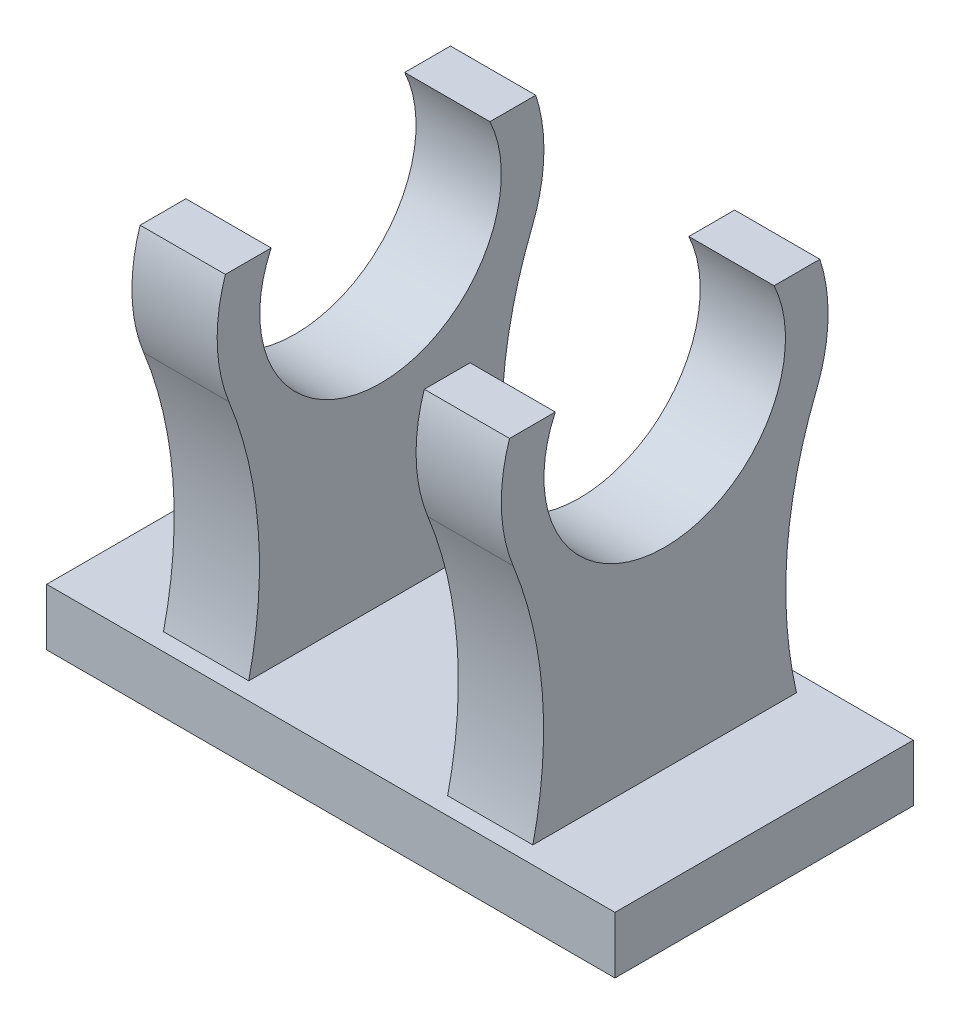
ISO-10303-21;
HEADER;
FILE_DESCRIPTION(('STEP AP214'),'2;1');
FILE_NAME('part.step','',(''),(''),'','','');
FILE_SCHEMA(('AUTOMOTIVE_DESIGN { 1 0 10303 214 1 1 1 1 }'));
ENDSEC;
DATA;
#1=APPLICATION_CONTEXT('core data for automotive mechanical design processes');
#2=APPLICATION_PROTOCOL_DEFINITION('international standard','automotive_design',2000,#1);
#3=PRODUCT_CONTEXT('',#1,'mechanical');
#4=PRODUCT('Part','Part','',(#3));
#5=PRODUCT_RELATED_PRODUCT_CATEGORY('part','',(#4));
#6=PRODUCT_DEFINITION_FORMATION('','',#4);
#7=PRODUCT_DEFINITION_CONTEXT('part definition',#1,'design');
#8=PRODUCT_DEFINITION('design','',#6,#7);
#9=PRODUCT_DEFINITION_SHAPE('','',#8);
#10=(LENGTH_UNIT() NAMED_UNIT(*) SI_UNIT(.MILLI.,.METRE.));
#11=(NAMED_UNIT(*) PLANE_ANGLE_UNIT() SI_UNIT($,.RADIAN.));
#12=(NAMED_UNIT(*) SI_UNIT($,.STERADIAN.) SOLID_ANGLE_UNIT());
#13=UNCERTAINTY_MEASURE_WITH_UNIT(LENGTH_MEASURE(1.E-05),#10,'distance_accuracy_value','');
#14=(GEOMETRIC_REPRESENTATION_CONTEXT(3) GLOBAL_UNCERTAINTY_ASSIGNED_CONTEXT((#13)) GLOBAL_UNIT_ASSIGNED_CONTEXT((#10,
#11,#12)) REPRESENTATION_CONTEXT('',''));
#15=CARTESIAN_POINT('',(0.,0.,0.));
#16=DIRECTION('',(0.,0.,1.));
#17=DIRECTION('',(1.,0.,0.));
#18=AXIS2_PLACEMENT_3D('',#15,#16,#17);
#19=CARTESIAN_POINT('',(-1.5,5.3196273089736,19.0797277488491));
#20=DIRECTION('',(1.,0.,0.));
#21=DIRECTION('',(0.,0.,-1.));
#22=AXIS2_PLACEMENT_3D('',#19,#20,#21);
#23=CYLINDRICAL_SURFACE('',#22,14.8175505504002);
#24=DIRECTION('',(1.,0.,0.));
#25=VECTOR('',#24,1.);
#26=CARTESIAN_POINT('',(-1.5,2.,4.63881784527373));
#27=LINE('',#26,#25);
#28=CARTESIAN_POINT('',(1.5,2.,4.63881784527373));
#29=VERTEX_POINT('',#28);
#30=CARTESIAN_POINT('',(-1.5,2.,4.63881784527373));
#31=VERTEX_POINT('',#30);
#32=EDGE_CURVE('E313',#29,#31,#27,.F.);
#33=ORIENTED_EDGE('',*,*,#32,.F.);
#34=CARTESIAN_POINT('',(1.5,5.3196273089736,19.0797277488491));
#35=DIRECTION('',(-1.,0.,0.));
#36=DIRECTION('',(0.,0.,-1.));
#37=AXIS2_PLACEMENT_3D('',#34,#35,#36);
#38=CIRCLE('',#37,14.8175505504002);
#39=CARTESIAN_POINT('',(1.5,10.8528243863953,5.33405445082267));
#40=VERTEX_POINT('',#39);
#41=EDGE_CURVE('E319',#40,#29,#38,.T.);
#42=ORIENTED_EDGE('',*,*,#41,.F.);
#43=DIRECTION('',(1.,0.,0.));
#44=VECTOR('',#43,1.);
#45=CARTESIAN_POINT('',(-1.5,10.8528243863953,5.33405445082267));
#46=LINE('',#45,#44);
#47=CARTESIAN_POINT('',(-1.5,10.8528243863953,5.33405445082267));
#48=VERTEX_POINT('',#47);
#49=EDGE_CURVE('E47',#48,#40,#46,.T.);
#50=ORIENTED_EDGE('',*,*,#49,.F.);
#51=CARTESIAN_POINT('',(-1.5,5.3196273089736,19.0797277488491));
#52=DIRECTION('',(-1.,0.,0.));
#53=DIRECTION('',(0.,0.,-1.));
#54=AXIS2_PLACEMENT_3D('',#51,#52,#53);
#55=CIRCLE('',#54,14.8175505504002);
#56=EDGE_CURVE('E345',#48,#31,#55,.T.);
#57=ORIENTED_EDGE('',*,*,#56,.T.);
#58=EDGE_LOOP('',(#33,#42,#50,#57));
#59=FACE_BOUND('',#58,.T.);
#60=ADVANCED_FACE('F39',(#59),#23,.F.);
#61=CARTESIAN_POINT('',(-1.5,13.,0.));
#62=DIRECTION('',(1.,0.,0.));
#63=DIRECTION('',(0.,0.,-1.));
#64=AXIS2_PLACEMENT_3D('',#61,#62,#63);
#65=CYLINDRICAL_SURFACE('',#64,5.75);
#66=ORIENTED_EDGE('',*,*,#49,.T.);
#67=CARTESIAN_POINT('',(1.5,13.,0.));
#68=DIRECTION('',(1.,0.,0.));
#69=DIRECTION('',(0.,0.,-1.));
#70=AXIS2_PLACEMENT_3D('',#67,#68,#69);
#71=CIRCLE('',#70,5.75);
#72=CARTESIAN_POINT('',(1.5,14.8,5.46099807727488));
#73=VERTEX_POINT('',#72);
#74=EDGE_CURVE('E341',#73,#40,#71,.T.);
#75=ORIENTED_EDGE('',*,*,#74,.F.);
#76=DIRECTION('',(1.,0.,0.));
#77=VECTOR('',#76,1.);
#78=CARTESIAN_POINT('',(-1.5,14.8,5.46099807727488));
#79=LINE('',#78,#77);
#80=CARTESIAN_POINT('',(-1.5,14.8,5.46099807727488));
#81=VERTEX_POINT('',#80);
#82=EDGE_CURVE('E373',#81,#73,#79,.T.);
#83=ORIENTED_EDGE('',*,*,#82,.F.);
#84=CARTESIAN_POINT('',(-1.5,13.,0.));
#85=DIRECTION('',(1.,0.,0.));
#86=DIRECTION('',(0.,0.,-1.));
#87=AXIS2_PLACEMENT_3D('',#84,#85,#86);
#88=CIRCLE('',#87,5.75);
#89=EDGE_CURVE('E367',#81,#48,#88,.T.);
#90=ORIENTED_EDGE('',*,*,#89,.T.);
#91=EDGE_LOOP('',(#66,#75,#83,#90));
#92=FACE_BOUND('',#91,.T.);
#93=ADVANCED_FACE('F409',(#92),#65,.T.);
#94=CARTESIAN_POINT('',(-1.5,14.8,5.46099807727489));
#95=DIRECTION('',(0.,1.,0.));
#96=DIRECTION('',(0.,0.,1.));
#97=AXIS2_PLACEMENT_3D('',#94,#95,#96);
#98=PLANE('',#97);
#99=ORIENTED_EDGE('',*,*,#82,.T.);
#100=DIRECTION('',(0.,0.,1.));
#101=VECTOR('',#100,1.);
#102=CARTESIAN_POINT('',(1.5,14.8,5.46099807727489));
#103=LINE('',#102,#101);
#104=CARTESIAN_POINT('',(1.5,14.8,3.85));
#105=VERTEX_POINT('',#104);
#106=EDGE_CURVE('E337',#105,#73,#103,.T.);
#107=ORIENTED_EDGE('',*,*,#106,.F.);
#108=DIRECTION('',(1.,0.,0.));
#109=VECTOR('',#108,1.);
#110=CARTESIAN_POINT('',(-1.5,14.8,3.85));
#111=LINE('',#110,#109);
#112=CARTESIAN_POINT('',(-1.5,14.8,3.85));
#113=VERTEX_POINT('',#112);
#114=EDGE_CURVE('E376',#113,#105,#111,.T.);
#115=ORIENTED_EDGE('',*,*,#114,.F.);
#116=DIRECTION('',(0.,0.,1.));
#117=VECTOR('',#116,1.);
#118=CARTESIAN_POINT('',(-1.5,14.8,5.46099807727489));
#119=LINE('',#118,#117);
#120=EDGE_CURVE('E363',#113,#81,#119,.T.);
#121=ORIENTED_EDGE('',*,*,#120,.T.);
#122=EDGE_LOOP('',(#99,#107,#115,#121));
#123=FACE_BOUND('',#122,.T.);
#124=ADVANCED_FACE('F414',(#123),#98,.T.);
#125=CARTESIAN_POINT('',(-1.5,13.,0.));
#126=DIRECTION('',(1.,0.,0.));
#127=DIRECTION('',(0.,0.,-1.));
#128=AXIS2_PLACEMENT_3D('',#125,#126,#127);
#129=CYLINDRICAL_SURFACE('',#128,4.25);
#130=ORIENTED_EDGE('',*,*,#114,.T.);
#131=CARTESIAN_POINT('',(1.5,13.,0.));
#132=DIRECTION('',(-1.,0.,0.));
#133=DIRECTION('',(0.,0.,-1.));
#134=AXIS2_PLACEMENT_3D('',#131,#132,#133);
#135=CIRCLE('',#134,4.25);
#136=CARTESIAN_POINT('',(1.5,14.8,-3.85));
#137=VERTEX_POINT('',#136);
#138=EDGE_CURVE('E333',#137,#105,#135,.T.);
#139=ORIENTED_EDGE('',*,*,#138,.F.);
#140=DIRECTION('',(1.,0.,0.));
#141=VECTOR('',#140,1.);
#142=CARTESIAN_POINT('',(-1.5,14.8,-3.85));
#143=LINE('',#142,#141);
#144=CARTESIAN_POINT('',(-1.5,14.8,-3.85));
#145=VERTEX_POINT('',#144);
#146=EDGE_CURVE('E379',#145,#137,#143,.T.);
#147=ORIENTED_EDGE('',*,*,#146,.F.);
#148=CARTESIAN_POINT('',(-1.5,13.,0.));
#149=DIRECTION('',(-1.,0.,0.));
#150=DIRECTION('',(0.,0.,-1.));
#151=AXIS2_PLACEMENT_3D('',#148,#149,#150);
#152=CIRCLE('',#151,4.25);
#153=EDGE_CURVE('E359',#145,#113,#152,.T.);
#154=ORIENTED_EDGE('',*,*,#153,.T.);
#155=EDGE_LOOP('',(#130,#139,#147,#154));
#156=FACE_BOUND('',#155,.T.);
#157=ADVANCED_FACE('F435',(#156),#129,.F.);
#158=CARTESIAN_POINT('',(-1.5,14.8,-3.85));
#159=DIRECTION('',(0.,1.,0.));
#160=DIRECTION('',(0.,0.,1.));
#161=AXIS2_PLACEMENT_3D('',#158,#159,#160);
#162=PLANE('',#161);
#163=ORIENTED_EDGE('',*,*,#146,.T.);
#164=DIRECTION('',(0.,0.,1.));
#165=VECTOR('',#164,1.);
#166=CARTESIAN_POINT('',(1.5,14.8,-3.85));
#167=LINE('',#166,#165);
#168=CARTESIAN_POINT('',(1.5,14.8,-5.46099807727489));
#169=VERTEX_POINT('',#168);
#170=EDGE_CURVE('E329',#169,#137,#167,.T.);
#171=ORIENTED_EDGE('',*,*,#170,.F.);
#172=DIRECTION('',(1.,0.,0.));
#173=VECTOR('',#172,1.);
#174=CARTESIAN_POINT('',(-1.5,14.8,-5.46099807727489));
#175=LINE('',#174,#173);
#176=CARTESIAN_POINT('',(-1.5,14.8,-5.46099807727489));
#177=VERTEX_POINT('',#176);
#178=EDGE_CURVE('E382',#177,#169,#175,.T.);
#179=ORIENTED_EDGE('',*,*,#178,.F.);
#180=DIRECTION('',(0.,0.,1.));
#181=VECTOR('',#180,1.);
#182=CARTESIAN_POINT('',(-1.5,14.8,-3.85));
#183=LINE('',#182,#181);
#184=EDGE_CURVE('E355',#177,#145,#183,.T.);
#185=ORIENTED_EDGE('',*,*,#184,.T.);
#186=EDGE_LOOP('',(#163,#171,#179,#185));
#187=FACE_BOUND('',#186,.T.);
#188=ADVANCED_FACE('F431',(#187),#162,.T.);
#189=CARTESIAN_POINT('',(-1.5,13.,0.));
#190=DIRECTION('',(1.,0.,0.));
#191=DIRECTION('',(0.,0.,-1.));
#192=AXIS2_PLACEMENT_3D('',#189,#190,#191);
#193=CYLINDRICAL_SURFACE('',#192,5.75);
#194=ORIENTED_EDGE('',*,*,#178,.T.);
#195=CARTESIAN_POINT('',(1.5,13.,0.));
#196=DIRECTION('',(1.,0.,0.));
#197=DIRECTION('',(0.,0.,-1.));
#198=AXIS2_PLACEMENT_3D('',#195,#196,#197);
#199=CIRCLE('',#198,5.75);
#200=CARTESIAN_POINT('',(1.5,10.8528243863953,-5.33405445082267));
#201=VERTEX_POINT('',#200);
#202=EDGE_CURVE('E325',#201,#169,#199,.T.);
#203=ORIENTED_EDGE('',*,*,#202,.F.);
#204=DIRECTION('',(1.,0.,0.));
#205=VECTOR('',#204,1.);
#206=CARTESIAN_POINT('',(-1.5,10.8528243863953,-5.33405445082267));
#207=LINE('',#206,#205);
#208=CARTESIAN_POINT('',(-1.5,10.8528243863953,-5.33405445082267));
#209=VERTEX_POINT('',#208);
#210=EDGE_CURVE('E385',#209,#201,#207,.T.);
#211=ORIENTED_EDGE('',*,*,#210,.F.);
#212=CARTESIAN_POINT('',(-1.5,13.,0.));
#213=DIRECTION('',(1.,0.,0.));
#214=DIRECTION('',(0.,0.,-1.));
#215=AXIS2_PLACEMENT_3D('',#212,#213,#214);
#216=CIRCLE('',#215,5.75);
#217=EDGE_CURVE('E351',#209,#177,#216,.T.);
#218=ORIENTED_EDGE('',*,*,#217,.T.);
#219=EDGE_LOOP('',(#194,#203,#211,#218));
#220=FACE_BOUND('',#219,.T.);
#221=ADVANCED_FACE('F427',(#220),#193,.T.);
#222=CARTESIAN_POINT('',(-1.5,5.3196273089736,-19.0797277488491));
#223=DIRECTION('',(1.,0.,0.));
#224=DIRECTION('',(0.,0.,-1.));
#225=AXIS2_PLACEMENT_3D('',#222,#223,#224);
#226=CYLINDRICAL_SURFACE('',#225,14.8175505504002);
#227=DIRECTION('',(1.,0.,0.));
#228=VECTOR('',#227,1.);
#229=CARTESIAN_POINT('',(-1.5,2.,-4.63881784527373));
#230=LINE('',#229,#228);
#231=CARTESIAN_POINT('',(-1.5,2.,-4.63881784527373));
#232=VERTEX_POINT('',#231);
#233=CARTESIAN_POINT('',(1.5,2.,-4.63881784527373));
#234=VERTEX_POINT('',#233);
#235=EDGE_CURVE('E54',#232,#234,#230,.T.);
#236=ORIENTED_EDGE('',*,*,#235,.F.);
#237=CARTESIAN_POINT('',(-1.5,5.3196273089736,-19.0797277488491));
#238=DIRECTION('',(-1.,0.,0.));
#239=DIRECTION('',(0.,0.,1.));
#240=AXIS2_PLACEMENT_3D('',#237,#238,#239);
#241=CIRCLE('',#240,14.8175505504002);
#242=EDGE_CURVE('E348',#232,#209,#241,.T.);
#243=ORIENTED_EDGE('',*,*,#242,.T.);
#244=ORIENTED_EDGE('',*,*,#210,.T.);
#245=CARTESIAN_POINT('',(1.5,5.3196273089736,-19.0797277488491));
#246=DIRECTION('',(-1.,0.,0.));
#247=DIRECTION('',(0.,0.,1.));
#248=AXIS2_PLACEMENT_3D('',#245,#246,#247);
#249=CIRCLE('',#248,14.8175505504002);
#250=EDGE_CURVE('E322',#234,#201,#249,.T.);
#251=ORIENTED_EDGE('',*,*,#250,.F.);
#252=EDGE_LOOP('',(#236,#243,#244,#251));
#253=FACE_BOUND('',#252,.T.);
#254=ADVANCED_FACE('F422',(#253),#226,.F.);
#255=CARTESIAN_POINT('',(-1.5,5.3196273089736,19.0797277488491));
#256=DIRECTION('',(1.,0.,0.));
#257=DIRECTION('',(0.,0.,-1.));
#258=AXIS2_PLACEMENT_3D('',#255,#256,#257);
#259=PLANE('',#258);
#260=ORIENTED_EDGE('',*,*,#242,.F.);
#261=DIRECTION('',(0.,0.,1.));
#262=VECTOR('',#261,1.);
#263=CARTESIAN_POINT('',(-1.5,2.,19.0797277488491));
#264=LINE('',#263,#262);
#265=EDGE_CURVE('E61',#232,#31,#264,.T.);
#266=ORIENTED_EDGE('',*,*,#265,.T.);
#267=ORIENTED_EDGE('',*,*,#56,.F.);
#268=ORIENTED_EDGE('',*,*,#89,.F.);
#269=ORIENTED_EDGE('',*,*,#120,.F.);
#270=ORIENTED_EDGE('',*,*,#153,.F.);
#271=ORIENTED_EDGE('',*,*,#184,.F.);
#272=ORIENTED_EDGE('',*,*,#217,.F.);
#273=EDGE_LOOP('',(#260,#266,#267,#268,#269,#270,#271,#272));
#274=FACE_BOUND('',#273,.T.);
#275=ADVANCED_FACE('F437',(#274),#259,.F.);
#276=CARTESIAN_POINT('',(1.5,5.3196273089736,19.0797277488491));
#277=DIRECTION('',(1.,0.,0.));
#278=DIRECTION('',(0.,0.,-1.));
#279=AXIS2_PLACEMENT_3D('',#276,#277,#278);
#280=PLANE('',#279);
#281=DIRECTION('',(0.,0.,1.));
#282=VECTOR('',#281,1.);
#283=CARTESIAN_POINT('',(1.5,2.,19.0797277488491));
#284=LINE('',#283,#282);
#285=EDGE_CURVE('E11',#234,#29,#284,.T.);
#286=ORIENTED_EDGE('',*,*,#285,.F.);
#287=ORIENTED_EDGE('',*,*,#250,.T.);
#288=ORIENTED_EDGE('',*,*,#202,.T.);
#289=ORIENTED_EDGE('',*,*,#170,.T.);
#290=ORIENTED_EDGE('',*,*,#138,.T.);
#291=ORIENTED_EDGE('',*,*,#106,.T.);
#292=ORIENTED_EDGE('',*,*,#74,.T.);
#293=ORIENTED_EDGE('',*,*,#41,.T.);
#294=EDGE_LOOP('',(#286,#287,#288,#289,#290,#291,#292,#293));
#295=FACE_BOUND('',#294,.T.);
#296=ADVANCED_FACE('F421',(#295),#280,.T.);
#297=CARTESIAN_POINT('',(0.,2.,0.));
#298=DIRECTION('',(0.,1.,0.));
#299=DIRECTION('',(0.,0.,1.));
#300=AXIS2_PLACEMENT_3D('',#297,#298,#299);
#301=PLANE('',#300);
#302=DIRECTION('',(1.,0.,0.));
#303=VECTOR('',#302,1.);
#304=CARTESIAN_POINT('',(5.,2.,-5.25));
#305=LINE('',#304,#303);
#306=CARTESIAN_POINT('',(-5.,2.,-5.25));
#307=VERTEX_POINT('',#306);
#308=CARTESIAN_POINT('',(15.,2.,-5.25));
#309=VERTEX_POINT('',#308);
#310=EDGE_CURVE('E191',#307,#309,#305,.T.);
#311=ORIENTED_EDGE('',*,*,#310,.F.);
#312=DIRECTION('',(0.,0.,-1.));
#313=VECTOR('',#312,1.);
#314=CARTESIAN_POINT('',(-5.,2.,-5.25));
#315=LINE('',#314,#313);
#316=CARTESIAN_POINT('',(-5.,2.,5.25));
#317=VERTEX_POINT('',#316);
#318=EDGE_CURVE('E187',#317,#307,#315,.T.);
#319=ORIENTED_EDGE('',*,*,#318,.F.);
#320=DIRECTION('',(-1.,0.,0.));
#321=VECTOR('',#320,1.);
#322=CARTESIAN_POINT('',(5.,2.,5.25));
#323=LINE('',#322,#321);
#324=CARTESIAN_POINT('',(15.,2.,5.25));
#325=VERTEX_POINT('',#324);
#326=EDGE_CURVE('E179',#325,#317,#323,.T.);
#327=ORIENTED_EDGE('',*,*,#326,.F.);
#328=DIRECTION('',(0.,0.,-1.));
#329=VECTOR('',#328,1.);
#330=CARTESIAN_POINT('',(15.,2.,-5.25));
#331=LINE('',#330,#329);
#332=EDGE_CURVE('E185',#325,#309,#331,.T.);
#333=ORIENTED_EDGE('',*,*,#332,.T.);
#334=EDGE_LOOP('',(#311,#319,#327,#333));
#335=FACE_BOUND('',#334,.T.);
#336=ORIENTED_EDGE('',*,*,#265,.F.);
#337=ORIENTED_EDGE('',*,*,#235,.T.);
#338=ORIENTED_EDGE('',*,*,#285,.T.);
#339=ORIENTED_EDGE('',*,*,#32,.T.);
#340=EDGE_LOOP('',(#336,#337,#338,#339));
#341=FACE_BOUND('',#340,.T.);
#342=DIRECTION('',(0.,0.,1.));
#343=VECTOR('',#342,1.);
#344=CARTESIAN_POINT('',(11.5,2.,19.0797277488491));
#345=LINE('',#344,#343);
#346=CARTESIAN_POINT('',(11.5,2.,-4.63881784527373));
#347=VERTEX_POINT('',#346);
#348=CARTESIAN_POINT('',(11.5,2.,4.63881784527373));
#349=VERTEX_POINT('',#348);
#350=EDGE_CURVE('E222',#347,#349,#345,.T.);
#351=ORIENTED_EDGE('',*,*,#350,.T.);
#352=DIRECTION('',(-1.,0.,0.));
#353=VECTOR('',#352,1.);
#354=CARTESIAN_POINT('',(11.5,2.,4.63881784527373));
#355=LINE('',#354,#353);
#356=CARTESIAN_POINT('',(8.5,2.,4.63881784527373));
#357=VERTEX_POINT('',#356);
#358=EDGE_CURVE('E218',#357,#349,#355,.F.);
#359=ORIENTED_EDGE('',*,*,#358,.F.);
#360=DIRECTION('',(0.,0.,1.));
#361=VECTOR('',#360,1.);
#362=CARTESIAN_POINT('',(8.5,2.,19.0797277488491));
#363=LINE('',#362,#361);
#364=CARTESIAN_POINT('',(8.5,2.,-4.63881784527373));
#365=VERTEX_POINT('',#364);
#366=EDGE_CURVE('E274',#365,#357,#363,.T.);
#367=ORIENTED_EDGE('',*,*,#366,.F.);
#368=DIRECTION('',(-1.,0.,0.));
#369=VECTOR('',#368,1.);
#370=CARTESIAN_POINT('',(11.5,2.,-4.63881784527373));
#371=LINE('',#370,#369);
#372=EDGE_CURVE('E213',#347,#365,#371,.T.);
#373=ORIENTED_EDGE('',*,*,#372,.F.);
#374=EDGE_LOOP('',(#351,#359,#367,#373));
#375=FACE_BOUND('',#374,.T.);
#376=ADVANCED_FACE('F182',(#335,#341,#375),#301,.T.);
#377=CARTESIAN_POINT('',(5.,2.,-5.25));
#378=DIRECTION('',(0.,0.,-1.));
#379=DIRECTION('',(-1.,0.,0.));
#380=AXIS2_PLACEMENT_3D('',#377,#378,#379);
#381=PLANE('',#380);
#382=DIRECTION('',(1.,0.,0.));
#383=VECTOR('',#382,1.);
#384=CARTESIAN_POINT('',(-1.5,0.,-5.25));
#385=LINE('',#384,#383);
#386=CARTESIAN_POINT('',(-5.,0.,-5.25));
#387=VERTEX_POINT('',#386);
#388=CARTESIAN_POINT('',(15.,0.,-5.25));
#389=VERTEX_POINT('',#388);
#390=EDGE_CURVE('E389',#387,#389,#385,.T.);
#391=ORIENTED_EDGE('',*,*,#390,.F.);
#392=DIRECTION('',(0.,-1.,0.));
#393=VECTOR('',#392,1.);
#394=CARTESIAN_POINT('',(-5.,2.,-5.25));
#395=LINE('',#394,#393);
#396=EDGE_CURVE('E305',#307,#387,#395,.T.);
#397=ORIENTED_EDGE('',*,*,#396,.F.);
#398=ORIENTED_EDGE('',*,*,#310,.T.);
#399=DIRECTION('',(0.,-1.,0.));
#400=VECTOR('',#399,1.);
#401=CARTESIAN_POINT('',(15.,2.,-5.25));
#402=LINE('',#401,#400);
#403=EDGE_CURVE('E201',#309,#389,#402,.T.);
#404=ORIENTED_EDGE('',*,*,#403,.T.);
#405=EDGE_LOOP('',(#391,#397,#398,#404));
#406=FACE_BOUND('',#405,.T.);
#407=ADVANCED_FACE('F396',(#406),#381,.T.);
#408=CARTESIAN_POINT('',(-5.,2.,-5.25));
#409=DIRECTION('',(-1.,0.,0.));
#410=DIRECTION('',(0.,0.,1.));
#411=AXIS2_PLACEMENT_3D('',#408,#409,#410);
#412=PLANE('',#411);
#413=DIRECTION('',(0.,0.,-1.));
#414=VECTOR('',#413,1.);
#415=CARTESIAN_POINT('',(-5.,0.,-5.25));
#416=LINE('',#415,#414);
#417=CARTESIAN_POINT('',(-5.,0.,5.25));
#418=VERTEX_POINT('',#417);
#419=EDGE_CURVE('E296',#418,#387,#416,.T.);
#420=ORIENTED_EDGE('',*,*,#419,.F.);
#421=DIRECTION('',(0.,-1.,0.));
#422=VECTOR('',#421,1.);
#423=CARTESIAN_POINT('',(-5.,2.,5.25));
#424=LINE('',#423,#422);
#425=EDGE_CURVE('E301',#317,#418,#424,.T.);
#426=ORIENTED_EDGE('',*,*,#425,.F.);
#427=ORIENTED_EDGE('',*,*,#318,.T.);
#428=ORIENTED_EDGE('',*,*,#396,.T.);
#429=EDGE_LOOP('',(#420,#426,#427,#428));
#430=FACE_BOUND('',#429,.T.);
#431=ADVANCED_FACE('F398',(#430),#412,.T.);
#432=CARTESIAN_POINT('',(5.,2.,5.25));
#433=DIRECTION('',(0.,0.,1.));
#434=DIRECTION('',(1.,0.,0.));
#435=AXIS2_PLACEMENT_3D('',#432,#433,#434);
#436=PLANE('',#435);
#437=DIRECTION('',(1.,0.,0.));
#438=VECTOR('',#437,1.);
#439=CARTESIAN_POINT('',(-1.5,0.,5.25));
#440=LINE('',#439,#438);
#441=CARTESIAN_POINT('',(15.,0.,5.25));
#442=VERTEX_POINT('',#441);
#443=EDGE_CURVE('E196',#418,#442,#440,.T.);
#444=ORIENTED_EDGE('',*,*,#443,.T.);
#445=DIRECTION('',(0.,-1.,0.));
#446=VECTOR('',#445,1.);
#447=CARTESIAN_POINT('',(15.,2.,5.25));
#448=LINE('',#447,#446);
#449=EDGE_CURVE('E194',#325,#442,#448,.T.);
#450=ORIENTED_EDGE('',*,*,#449,.F.);
#451=ORIENTED_EDGE('',*,*,#326,.T.);
#452=ORIENTED_EDGE('',*,*,#425,.T.);
#453=EDGE_LOOP('',(#444,#450,#451,#452));
#454=FACE_BOUND('',#453,.T.);
#455=ADVANCED_FACE('F195',(#454),#436,.T.);
#456=CARTESIAN_POINT('',(-1.5,0.,5.25));
#457=DIRECTION('',(0.,-1.,0.));
#458=DIRECTION('',(0.,0.,-1.));
#459=AXIS2_PLACEMENT_3D('',#456,#457,#458);
#460=PLANE('',#459);
#461=ORIENTED_EDGE('',*,*,#390,.T.);
#462=DIRECTION('',(0.,0.,-1.));
#463=VECTOR('',#462,1.);
#464=CARTESIAN_POINT('',(15.,0.,-5.25));
#465=LINE('',#464,#463);
#466=EDGE_CURVE('E207',#442,#389,#465,.T.);
#467=ORIENTED_EDGE('',*,*,#466,.F.);
#468=ORIENTED_EDGE('',*,*,#443,.F.);
#469=ORIENTED_EDGE('',*,*,#419,.T.);
#470=EDGE_LOOP('',(#461,#467,#468,#469));
#471=FACE_BOUND('',#470,.T.);
#472=ADVANCED_FACE('F393',(#471),#460,.T.);
#473=CARTESIAN_POINT('',(11.5,5.3196273089736,19.0797277488491));
#474=DIRECTION('',(-1.,0.,0.));
#475=DIRECTION('',(0.,0.,-1.));
#476=AXIS2_PLACEMENT_3D('',#473,#474,#475);
#477=CYLINDRICAL_SURFACE('',#476,14.8175505504002);
#478=ORIENTED_EDGE('',*,*,#358,.T.);
#479=CARTESIAN_POINT('',(11.5,5.3196273089736,19.0797277488491));
#480=DIRECTION('',(-1.,0.,0.));
#481=DIRECTION('',(0.,0.,-1.));
#482=AXIS2_PLACEMENT_3D('',#479,#480,#481);
#483=CIRCLE('',#482,14.8175505504002);
#484=CARTESIAN_POINT('',(11.5,10.8528243863953,5.33405445082267));
#485=VERTEX_POINT('',#484);
#486=EDGE_CURVE('E247',#485,#349,#483,.T.);
#487=ORIENTED_EDGE('',*,*,#486,.F.);
#488=DIRECTION('',(-1.,0.,0.));
#489=VECTOR('',#488,1.);
#490=CARTESIAN_POINT('',(11.5,10.8528243863953,5.33405445082267));
#491=LINE('',#490,#489);
#492=CARTESIAN_POINT('',(8.5,10.8528243863953,5.33405445082267));
#493=VERTEX_POINT('',#492);
#494=EDGE_CURVE('E270',#485,#493,#491,.T.);
#495=ORIENTED_EDGE('',*,*,#494,.T.);
#496=CARTESIAN_POINT('',(8.5,5.3196273089736,19.0797277488491));
#497=DIRECTION('',(-1.,0.,0.));
#498=DIRECTION('',(0.,0.,-1.));
#499=AXIS2_PLACEMENT_3D('',#496,#497,#498);
#500=CIRCLE('',#499,14.8175505504002);
#501=EDGE_CURVE('E225',#493,#357,#500,.T.);
#502=ORIENTED_EDGE('',*,*,#501,.T.);
#503=EDGE_LOOP('',(#478,#487,#495,#502));
#504=FACE_BOUND('',#503,.T.);
#505=ADVANCED_FACE('F456',(#504),#477,.F.);
#506=CARTESIAN_POINT('',(11.5,13.,0.));
#507=DIRECTION('',(-1.,0.,0.));
#508=DIRECTION('',(0.,0.,-1.));
#509=AXIS2_PLACEMENT_3D('',#506,#507,#508);
#510=CYLINDRICAL_SURFACE('',#509,5.75);
#511=ORIENTED_EDGE('',*,*,#494,.F.);
#512=CARTESIAN_POINT('',(11.5,13.,0.));
#513=DIRECTION('',(1.,0.,0.));
#514=DIRECTION('',(0.,0.,-1.));
#515=AXIS2_PLACEMENT_3D('',#512,#513,#514);
#516=CIRCLE('',#515,5.75);
#517=CARTESIAN_POINT('',(11.5,14.8,5.46099807727488));
#518=VERTEX_POINT('',#517);
#519=EDGE_CURVE('E266',#518,#485,#516,.T.);
#520=ORIENTED_EDGE('',*,*,#519,.F.);
#521=DIRECTION('',(-1.,0.,0.));
#522=VECTOR('',#521,1.);
#523=CARTESIAN_POINT('',(11.5,14.8,5.46099807727488));
#524=LINE('',#523,#522);
#525=CARTESIAN_POINT('',(8.5,14.8,5.46099807727488));
#526=VERTEX_POINT('',#525);
#527=EDGE_CURVE('E275',#518,#526,#524,.T.);
#528=ORIENTED_EDGE('',*,*,#527,.T.);
#529=CARTESIAN_POINT('',(8.5,13.,0.));
#530=DIRECTION('',(1.,0.,0.));
#531=DIRECTION('',(0.,0.,-1.));
#532=AXIS2_PLACEMENT_3D('',#529,#530,#531);
#533=CIRCLE('',#532,5.75);
#534=EDGE_CURVE('E244',#526,#493,#533,.T.);
#535=ORIENTED_EDGE('',*,*,#534,.T.);
#536=EDGE_LOOP('',(#511,#520,#528,#535));
#537=FACE_BOUND('',#536,.T.);
#538=ADVANCED_FACE('F460',(#537),#510,.T.);
#539=CARTESIAN_POINT('',(11.5,14.8,5.46099807727489));
#540=DIRECTION('',(0.,1.,0.));
#541=DIRECTION('',(0.,0.,1.));
#542=AXIS2_PLACEMENT_3D('',#539,#540,#541);
#543=PLANE('',#542);
#544=ORIENTED_EDGE('',*,*,#527,.F.);
#545=DIRECTION('',(0.,0.,1.));
#546=VECTOR('',#545,1.);
#547=CARTESIAN_POINT('',(11.5,14.8,5.46099807727489));
#548=LINE('',#547,#546);
#549=CARTESIAN_POINT('',(11.5,14.8,3.85));
#550=VERTEX_POINT('',#549);
#551=EDGE_CURVE('E263',#550,#518,#548,.T.);
#552=ORIENTED_EDGE('',*,*,#551,.F.);
#553=DIRECTION('',(-1.,0.,0.));
#554=VECTOR('',#553,1.);
#555=CARTESIAN_POINT('',(11.5,14.8,3.85));
#556=LINE('',#555,#554);
#557=CARTESIAN_POINT('',(8.5,14.8,3.85));
#558=VERTEX_POINT('',#557);
#559=EDGE_CURVE('E279',#550,#558,#556,.T.);
#560=ORIENTED_EDGE('',*,*,#559,.T.);
#561=DIRECTION('',(0.,0.,1.));
#562=VECTOR('',#561,1.);
#563=CARTESIAN_POINT('',(8.5,14.8,5.46099807727489));
#564=LINE('',#563,#562);
#565=EDGE_CURVE('E241',#558,#526,#564,.T.);
#566=ORIENTED_EDGE('',*,*,#565,.T.);
#567=EDGE_LOOP('',(#544,#552,#560,#566));
#568=FACE_BOUND('',#567,.T.);
#569=ADVANCED_FACE('F466',(#568),#543,.T.);
#570=CARTESIAN_POINT('',(11.5,13.,0.));
#571=DIRECTION('',(-1.,0.,0.));
#572=DIRECTION('',(0.,0.,-1.));
#573=AXIS2_PLACEMENT_3D('',#570,#571,#572);
#574=CYLINDRICAL_SURFACE('',#573,4.25);
#575=ORIENTED_EDGE('',*,*,#559,.F.);
#576=CARTESIAN_POINT('',(11.5,13.,0.));
#577=DIRECTION('',(-1.,0.,0.));
#578=DIRECTION('',(0.,0.,-1.));
#579=AXIS2_PLACEMENT_3D('',#576,#577,#578);
#580=CIRCLE('',#579,4.25);
#581=CARTESIAN_POINT('',(11.5,14.8,-3.85));
#582=VERTEX_POINT('',#581);
#583=EDGE_CURVE('E260',#582,#550,#580,.T.);
#584=ORIENTED_EDGE('',*,*,#583,.F.);
#585=DIRECTION('',(-1.,0.,0.));
#586=VECTOR('',#585,1.);
#587=CARTESIAN_POINT('',(11.5,14.8,-3.85));
#588=LINE('',#587,#586);
#589=CARTESIAN_POINT('',(8.5,14.8,-3.85));
#590=VERTEX_POINT('',#589);
#591=EDGE_CURVE('E283',#582,#590,#588,.T.);
#592=ORIENTED_EDGE('',*,*,#591,.T.);
#593=CARTESIAN_POINT('',(8.5,13.,0.));
#594=DIRECTION('',(-1.,0.,0.));
#595=DIRECTION('',(0.,0.,-1.));
#596=AXIS2_PLACEMENT_3D('',#593,#594,#595);
#597=CIRCLE('',#596,4.25);
#598=EDGE_CURVE('E238',#590,#558,#597,.T.);
#599=ORIENTED_EDGE('',*,*,#598,.T.);
#600=EDGE_LOOP('',(#575,#584,#592,#599));
#601=FACE_BOUND('',#600,.T.);
#602=ADVANCED_FACE('F567',(#601),#574,.F.);
#603=CARTESIAN_POINT('',(11.5,14.8,-3.85));
#604=DIRECTION('',(0.,1.,0.));
#605=DIRECTION('',(0.,0.,1.));
#606=AXIS2_PLACEMENT_3D('',#603,#604,#605);
#607=PLANE('',#606);
#608=ORIENTED_EDGE('',*,*,#591,.F.);
#609=DIRECTION('',(0.,0.,1.));
#610=VECTOR('',#609,1.);
#611=CARTESIAN_POINT('',(11.5,14.8,-3.85));
#612=LINE('',#611,#610);
#613=CARTESIAN_POINT('',(11.5,14.8,-5.46099807727489));
#614=VERTEX_POINT('',#613);
#615=EDGE_CURVE('E257',#614,#582,#612,.T.);
#616=ORIENTED_EDGE('',*,*,#615,.F.);
#617=DIRECTION('',(-1.,0.,0.));
#618=VECTOR('',#617,1.);
#619=CARTESIAN_POINT('',(11.5,14.8,-5.46099807727489));
#620=LINE('',#619,#618);
#621=CARTESIAN_POINT('',(8.5,14.8,-5.46099807727489));
#622=VERTEX_POINT('',#621);
#623=EDGE_CURVE('E287',#614,#622,#620,.T.);
#624=ORIENTED_EDGE('',*,*,#623,.T.);
#625=DIRECTION('',(0.,0.,1.));
#626=VECTOR('',#625,1.);
#627=CARTESIAN_POINT('',(8.5,14.8,-3.85));
#628=LINE('',#627,#626);
#629=EDGE_CURVE('E235',#622,#590,#628,.T.);
#630=ORIENTED_EDGE('',*,*,#629,.T.);
#631=EDGE_LOOP('',(#608,#616,#624,#630));
#632=FACE_BOUND('',#631,.T.);
#633=ADVANCED_FACE('F576',(#632),#607,.T.);
#634=CARTESIAN_POINT('',(11.5,13.,0.));
#635=DIRECTION('',(-1.,0.,0.));
#636=DIRECTION('',(0.,0.,-1.));
#637=AXIS2_PLACEMENT_3D('',#634,#635,#636);
#638=CYLINDRICAL_SURFACE('',#637,5.75);
#639=ORIENTED_EDGE('',*,*,#623,.F.);
#640=CARTESIAN_POINT('',(11.5,13.,0.));
#641=DIRECTION('',(1.,0.,0.));
#642=DIRECTION('',(0.,0.,-1.));
#643=AXIS2_PLACEMENT_3D('',#640,#641,#642);
#644=CIRCLE('',#643,5.75);
#645=CARTESIAN_POINT('',(11.5,10.8528243863953,-5.33405445082267));
#646=VERTEX_POINT('',#645);
#647=EDGE_CURVE('E254',#646,#614,#644,.T.);
#648=ORIENTED_EDGE('',*,*,#647,.F.);
#649=DIRECTION('',(-1.,0.,0.));
#650=VECTOR('',#649,1.);
#651=CARTESIAN_POINT('',(11.5,10.8528243863953,-5.33405445082267));
#652=LINE('',#651,#650);
#653=CARTESIAN_POINT('',(8.5,10.8528243863953,-5.33405445082267));
#654=VERTEX_POINT('',#653);
#655=EDGE_CURVE('E269',#646,#654,#652,.T.);
#656=ORIENTED_EDGE('',*,*,#655,.T.);
#657=CARTESIAN_POINT('',(8.5,13.,0.));
#658=DIRECTION('',(1.,0.,0.));
#659=DIRECTION('',(0.,0.,-1.));
#660=AXIS2_PLACEMENT_3D('',#657,#658,#659);
#661=CIRCLE('',#660,5.75);
#662=EDGE_CURVE('E232',#654,#622,#661,.T.);
#663=ORIENTED_EDGE('',*,*,#662,.T.);
#664=EDGE_LOOP('',(#639,#648,#656,#663));
#665=FACE_BOUND('',#664,.T.);
#666=ADVANCED_FACE('F585',(#665),#638,.T.);
#667=CARTESIAN_POINT('',(11.5,5.3196273089736,-19.0797277488491));
#668=DIRECTION('',(-1.,0.,0.));
#669=DIRECTION('',(0.,0.,-1.));
#670=AXIS2_PLACEMENT_3D('',#667,#668,#669);
#671=CYLINDRICAL_SURFACE('',#670,14.8175505504002);
#672=ORIENTED_EDGE('',*,*,#372,.T.);
#673=CARTESIAN_POINT('',(8.5,5.3196273089736,-19.0797277488491));
#674=DIRECTION('',(-1.,0.,0.));
#675=DIRECTION('',(0.,0.,1.));
#676=AXIS2_PLACEMENT_3D('',#673,#674,#675);
#677=CIRCLE('',#676,14.8175505504002);
#678=EDGE_CURVE('E229',#365,#654,#677,.T.);
#679=ORIENTED_EDGE('',*,*,#678,.T.);
#680=ORIENTED_EDGE('',*,*,#655,.F.);
#681=CARTESIAN_POINT('',(11.5,5.3196273089736,-19.0797277488491));
#682=DIRECTION('',(-1.,0.,0.));
#683=DIRECTION('',(0.,0.,1.));
#684=AXIS2_PLACEMENT_3D('',#681,#682,#683);
#685=CIRCLE('',#684,14.8175505504002);
#686=EDGE_CURVE('E251',#347,#646,#685,.T.);
#687=ORIENTED_EDGE('',*,*,#686,.F.);
#688=EDGE_LOOP('',(#672,#679,#680,#687));
#689=FACE_BOUND('',#688,.T.);
#690=ADVANCED_FACE('F470',(#689),#671,.F.);
#691=CARTESIAN_POINT('',(11.5,5.3196273089736,19.0797277488491));
#692=DIRECTION('',(-1.,0.,0.));
#693=DIRECTION('',(0.,0.,-1.));
#694=AXIS2_PLACEMENT_3D('',#691,#692,#693);
#695=PLANE('',#694);
#696=ORIENTED_EDGE('',*,*,#686,.T.);
#697=ORIENTED_EDGE('',*,*,#647,.T.);
#698=ORIENTED_EDGE('',*,*,#615,.T.);
#699=ORIENTED_EDGE('',*,*,#583,.T.);
#700=ORIENTED_EDGE('',*,*,#551,.T.);
#701=ORIENTED_EDGE('',*,*,#519,.T.);
#702=ORIENTED_EDGE('',*,*,#486,.T.);
#703=ORIENTED_EDGE('',*,*,#350,.F.);
#704=EDGE_LOOP('',(#696,#697,#698,#699,#700,#701,#702,#703));
#705=FACE_BOUND('',#704,.T.);
#706=ADVANCED_FACE('F601',(#705),#695,.F.);
#707=CARTESIAN_POINT('',(8.5,5.3196273089736,19.0797277488491));
#708=DIRECTION('',(-1.,0.,0.));
#709=DIRECTION('',(0.,0.,-1.));
#710=AXIS2_PLACEMENT_3D('',#707,#708,#709);
#711=PLANE('',#710);
#712=ORIENTED_EDGE('',*,*,#366,.T.);
#713=ORIENTED_EDGE('',*,*,#501,.F.);
#714=ORIENTED_EDGE('',*,*,#534,.F.);
#715=ORIENTED_EDGE('',*,*,#565,.F.);
#716=ORIENTED_EDGE('',*,*,#598,.F.);
#717=ORIENTED_EDGE('',*,*,#629,.F.);
#718=ORIENTED_EDGE('',*,*,#662,.F.);
#719=ORIENTED_EDGE('',*,*,#678,.F.);
#720=EDGE_LOOP('',(#712,#713,#714,#715,#716,#717,#718,#719));
#721=FACE_BOUND('',#720,.T.);
#722=ADVANCED_FACE('F609',(#721),#711,.T.);
#723=CARTESIAN_POINT('',(15.,2.,-5.25));
#724=DIRECTION('',(1.,0.,0.));
#725=DIRECTION('',(0.,0.,1.));
#726=AXIS2_PLACEMENT_3D('',#723,#724,#725);
#727=PLANE('',#726);
#728=ORIENTED_EDGE('',*,*,#466,.T.);
#729=ORIENTED_EDGE('',*,*,#403,.F.);
#730=ORIENTED_EDGE('',*,*,#332,.F.);
#731=ORIENTED_EDGE('',*,*,#449,.T.);
#732=EDGE_LOOP('',(#728,#729,#730,#731));
#733=FACE_BOUND('',#732,.T.);
#734=ADVANCED_FACE('F204',(#733),#727,.T.);
#735=CLOSED_SHELL('',(#60,#93,#124,#157,#188,#221,#254,#275,#296,#376,#407,#431,#455,#472,#505,
#538,#569,#602,#633,#666,#690,#706,#722,#734));
#736=MANIFOLD_SOLID_BREP('B2',#735);
#737=ADVANCED_BREP_SHAPE_REPRESENTATION('',(#18,#736),#14);
#738=SHAPE_DEFINITION_REPRESENTATION(#9,#737);
ENDSEC;
END-ISO-10303-21;
